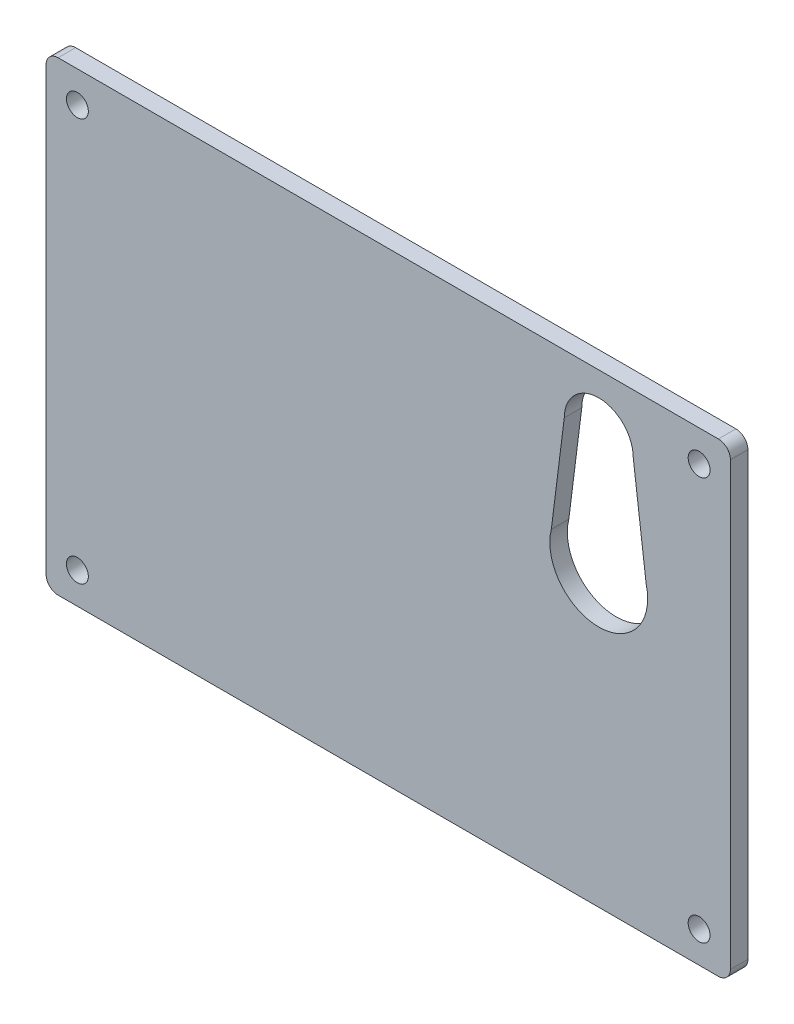
ISO-10303-21;
HEADER;
FILE_DESCRIPTION(('STEP AP214'),'2;1');
FILE_NAME('part.step','',(''),(''),'','','');
FILE_SCHEMA(('AUTOMOTIVE_DESIGN { 1 0 10303 214 1 1 1 1 }'));
ENDSEC;
DATA;
#1=APPLICATION_CONTEXT('core data for automotive mechanical design processes');
#2=APPLICATION_PROTOCOL_DEFINITION('international standard','automotive_design',2000,#1);
#3=PRODUCT_CONTEXT('',#1,'mechanical');
#4=PRODUCT('Part','Part','',(#3));
#5=PRODUCT_RELATED_PRODUCT_CATEGORY('part','',(#4));
#6=PRODUCT_DEFINITION_FORMATION('','',#4);
#7=PRODUCT_DEFINITION_CONTEXT('part definition',#1,'design');
#8=PRODUCT_DEFINITION('design','',#6,#7);
#9=PRODUCT_DEFINITION_SHAPE('','',#8);
#10=(LENGTH_UNIT() NAMED_UNIT(*) SI_UNIT(.MILLI.,.METRE.));
#11=(NAMED_UNIT(*) PLANE_ANGLE_UNIT() SI_UNIT($,.RADIAN.));
#12=(NAMED_UNIT(*) SI_UNIT($,.STERADIAN.) SOLID_ANGLE_UNIT());
#13=UNCERTAINTY_MEASURE_WITH_UNIT(LENGTH_MEASURE(1.E-05),#10,'distance_accuracy_value','');
#14=(GEOMETRIC_REPRESENTATION_CONTEXT(3) GLOBAL_UNCERTAINTY_ASSIGNED_CONTEXT((#13)) GLOBAL_UNIT_ASSIGNED_CONTEXT((#10,
#11,#12)) REPRESENTATION_CONTEXT('',''));
#15=CARTESIAN_POINT('',(0.,0.,0.));
#16=DIRECTION('',(0.,0.,1.));
#17=DIRECTION('',(1.,0.,0.));
#18=AXIS2_PLACEMENT_3D('',#15,#16,#17);
#19=CARTESIAN_POINT('',(33.5751412984427,20.6026828451147,2.));
#20=DIRECTION('',(0.,0.,-1.));
#21=DIRECTION('',(-1.,0.,0.));
#22=AXIS2_PLACEMENT_3D('',#19,#20,#21);
#23=CYLINDRICAL_SURFACE('',#22,3.93700000000001);
#24=CARTESIAN_POINT('',(33.5751412984427,20.6026828451147,0.));
#25=DIRECTION('',(0.,0.,1.));
#26=DIRECTION('',(1.,0.,0.));
#27=AXIS2_PLACEMENT_3D('',#24,#25,#26);
#28=CIRCLE('',#27,3.93700000000001);
#29=CARTESIAN_POINT('',(37.5121412984427,20.6026828451147,0.));
#30=VERTEX_POINT('',#29);
#31=CARTESIAN_POINT('',(29.6381412984427,20.6026828451147,0.));
#32=VERTEX_POINT('',#31);
#33=EDGE_CURVE('E191',#30,#32,#28,.T.);
#34=ORIENTED_EDGE('',*,*,#33,.F.);
#35=DIRECTION('',(0.,0.,-1.));
#36=VECTOR('',#35,1.);
#37=CARTESIAN_POINT('',(37.5121412984427,20.6026828451147,2.));
#38=LINE('',#37,#36);
#39=CARTESIAN_POINT('',(37.5121412984427,20.6026828451147,2.));
#40=VERTEX_POINT('',#39);
#41=EDGE_CURVE('E11',#40,#30,#38,.T.);
#42=ORIENTED_EDGE('',*,*,#41,.F.);
#43=CARTESIAN_POINT('',(33.5751412984427,20.6026828451147,2.));
#44=DIRECTION('',(0.,0.,1.));
#45=DIRECTION('',(1.,0.,0.));
#46=AXIS2_PLACEMENT_3D('',#43,#44,#45);
#47=CIRCLE('',#46,3.93700000000001);
#48=CARTESIAN_POINT('',(29.6381412984427,20.6026828451147,2.));
#49=VERTEX_POINT('',#48);
#50=EDGE_CURVE('E145',#40,#49,#47,.T.);
#51=ORIENTED_EDGE('',*,*,#50,.T.);
#52=DIRECTION('',(0.,0.,-1.));
#53=VECTOR('',#52,1.);
#54=CARTESIAN_POINT('',(29.6381412984427,20.6026828451147,2.));
#55=LINE('',#54,#53);
#56=EDGE_CURVE('E106',#49,#32,#55,.T.);
#57=ORIENTED_EDGE('',*,*,#56,.T.);
#58=EDGE_LOOP('',(#34,#42,#51,#57));
#59=FACE_BOUND('',#58,.T.);
#60=ADVANCED_FACE('F41',(#59),#23,.F.);
#61=CARTESIAN_POINT('',(39.4768304362522,4.95737892728822,2.));
#62=DIRECTION('',(0.992207263968777,0.124598335974414,0.));
#63=DIRECTION('',(-0.124598335974414,0.992207263968777,0.));
#64=AXIS2_PLACEMENT_3D('',#61,#62,#63);
#65=PLANE('',#64);
#66=DIRECTION('',(0.124598335974414,-0.992207263968777,0.));
#67=VECTOR('',#66,1.);
#68=CARTESIAN_POINT('',(39.4768304362522,4.95737892728822,0.));
#69=LINE('',#68,#67);
#70=CARTESIAN_POINT('',(38.9896367446615,8.83702239102872,0.));
#71=VERTEX_POINT('',#70);
#72=EDGE_CURVE('E151',#30,#71,#69,.T.);
#73=ORIENTED_EDGE('',*,*,#72,.T.);
#74=DIRECTION('',(0.,0.,-1.));
#75=VECTOR('',#74,1.);
#76=CARTESIAN_POINT('',(38.9896367446615,8.83702239102872,2.));
#77=LINE('',#76,#75);
#78=CARTESIAN_POINT('',(38.9896367446615,8.83702239102872,2.));
#79=VERTEX_POINT('',#78);
#80=EDGE_CURVE('E51',#79,#71,#77,.T.);
#81=ORIENTED_EDGE('',*,*,#80,.F.);
#82=DIRECTION('',(0.124598335974414,-0.992207263968777,0.));
#83=VECTOR('',#82,1.);
#84=CARTESIAN_POINT('',(39.4768304362522,4.95737892728822,2.));
#85=LINE('',#84,#83);
#86=EDGE_CURVE('E140',#40,#79,#85,.T.);
#87=ORIENTED_EDGE('',*,*,#86,.F.);
#88=ORIENTED_EDGE('',*,*,#41,.T.);
#89=EDGE_LOOP('',(#73,#81,#87,#88));
#90=FACE_BOUND('',#89,.T.);
#91=ADVANCED_FACE('F149',(#90),#65,.F.);
#92=CARTESIAN_POINT('',(33.5751412984427,7.45536285884434,2.));
#93=DIRECTION('',(0.,0.,-1.));
#94=DIRECTION('',(-1.,0.,0.));
#95=AXIS2_PLACEMENT_3D('',#92,#93,#94);
#96=CYLINDRICAL_SURFACE('',#95,5.58800000000001);
#97=CARTESIAN_POINT('',(33.5751412984427,7.45536285884434,0.));
#98=DIRECTION('',(0.,0.,1.));
#99=DIRECTION('',(1.,0.,0.));
#100=AXIS2_PLACEMENT_3D('',#97,#98,#99);
#101=CIRCLE('',#100,5.58800000000001);
#102=CARTESIAN_POINT('',(28.1606458522239,8.83702239102872,0.));
#103=VERTEX_POINT('',#102);
#104=EDGE_CURVE('E195',#103,#71,#101,.T.);
#105=ORIENTED_EDGE('',*,*,#104,.F.);
#106=DIRECTION('',(0.,0.,-1.));
#107=VECTOR('',#106,1.);
#108=CARTESIAN_POINT('',(28.1606458522239,8.83702239102872,2.));
#109=LINE('',#108,#107);
#110=CARTESIAN_POINT('',(28.1606458522239,8.83702239102872,2.));
#111=VERTEX_POINT('',#110);
#112=EDGE_CURVE('E99',#111,#103,#109,.T.);
#113=ORIENTED_EDGE('',*,*,#112,.F.);
#114=CARTESIAN_POINT('',(33.5751412984427,7.45536285884434,2.));
#115=DIRECTION('',(0.,0.,1.));
#116=DIRECTION('',(1.,0.,0.));
#117=AXIS2_PLACEMENT_3D('',#114,#115,#116);
#118=CIRCLE('',#117,5.58800000000001);
#119=EDGE_CURVE('E144',#111,#79,#118,.T.);
#120=ORIENTED_EDGE('',*,*,#119,.T.);
#121=ORIENTED_EDGE('',*,*,#80,.T.);
#122=EDGE_LOOP('',(#105,#113,#120,#121));
#123=FACE_BOUND('',#122,.T.);
#124=ADVANCED_FACE('F156',(#123),#96,.F.);
#125=CARTESIAN_POINT('',(48.6101412984428,0.,2.));
#126=DIRECTION('',(-1.,0.,0.));
#127=DIRECTION('',(0.,0.,1.));
#128=AXIS2_PLACEMENT_3D('',#125,#126,#127);
#129=PLANE('',#128);
#130=DIRECTION('',(0.,1.,0.));
#131=VECTOR('',#130,1.);
#132=CARTESIAN_POINT('',(48.6101412984428,0.,0.));
#133=LINE('',#132,#131);
#134=CARTESIAN_POINT('',(48.6101412984428,-24.4756371411557,0.));
#135=VERTEX_POINT('',#134);
#136=CARTESIAN_POINT('',(48.6101412984428,25.9243628588443,0.));
#137=VERTEX_POINT('',#136);
#138=EDGE_CURVE('E174',#135,#137,#133,.T.);
#139=ORIENTED_EDGE('',*,*,#138,.T.);
#140=DIRECTION('',(0.,0.,-1.));
#141=VECTOR('',#140,1.);
#142=CARTESIAN_POINT('',(48.6101412984428,25.9243628588443,2.));
#143=LINE('',#142,#141);
#144=CARTESIAN_POINT('',(48.6101412984428,25.9243628588443,2.));
#145=VERTEX_POINT('',#144);
#146=EDGE_CURVE('E45',#145,#137,#143,.T.);
#147=ORIENTED_EDGE('',*,*,#146,.F.);
#148=DIRECTION('',(0.,1.,0.));
#149=VECTOR('',#148,1.);
#150=CARTESIAN_POINT('',(48.6101412984428,0.,2.));
#151=LINE('',#150,#149);
#152=CARTESIAN_POINT('',(48.6101412984428,-24.4756371411557,2.));
#153=VERTEX_POINT('',#152);
#154=EDGE_CURVE('E497',#153,#145,#151,.T.);
#155=ORIENTED_EDGE('',*,*,#154,.F.);
#156=DIRECTION('',(0.,0.,-1.));
#157=VECTOR('',#156,1.);
#158=CARTESIAN_POINT('',(48.6101412984428,-24.4756371411557,2.));
#159=LINE('',#158,#157);
#160=EDGE_CURVE('E158',#153,#135,#159,.T.);
#161=ORIENTED_EDGE('',*,*,#160,.T.);
#162=EDGE_LOOP('',(#139,#147,#155,#161));
#163=FACE_BOUND('',#162,.T.);
#164=ADVANCED_FACE('F228',(#163),#129,.F.);
#165=CARTESIAN_POINT('',(47.2351412984428,25.9243628588443,2.));
#166=DIRECTION('',(0.,0.,-1.));
#167=DIRECTION('',(-1.,0.,0.));
#168=AXIS2_PLACEMENT_3D('',#165,#166,#167);
#169=CYLINDRICAL_SURFACE('',#168,1.375);
#170=CARTESIAN_POINT('',(47.2351412984428,25.9243628588443,0.));
#171=DIRECTION('',(0.,0.,1.));
#172=DIRECTION('',(1.,0.,0.));
#173=AXIS2_PLACEMENT_3D('',#170,#171,#172);
#174=CIRCLE('',#173,1.375);
#175=CARTESIAN_POINT('',(47.2351412984428,27.2993628588443,0.));
#176=VERTEX_POINT('',#175);
#177=EDGE_CURVE('E177',#137,#176,#174,.T.);
#178=ORIENTED_EDGE('',*,*,#177,.T.);
#179=DIRECTION('',(0.,0.,-1.));
#180=VECTOR('',#179,1.);
#181=CARTESIAN_POINT('',(47.2351412984428,27.2993628588443,2.));
#182=LINE('',#181,#180);
#183=CARTESIAN_POINT('',(47.2351412984428,27.2993628588443,2.));
#184=VERTEX_POINT('',#183);
#185=EDGE_CURVE('E218',#184,#176,#182,.T.);
#186=ORIENTED_EDGE('',*,*,#185,.F.);
#187=CARTESIAN_POINT('',(47.2351412984428,25.9243628588443,2.));
#188=DIRECTION('',(0.,0.,1.));
#189=DIRECTION('',(1.,0.,0.));
#190=AXIS2_PLACEMENT_3D('',#187,#188,#189);
#191=CIRCLE('',#190,1.375);
#192=EDGE_CURVE('E114',#145,#184,#191,.T.);
#193=ORIENTED_EDGE('',*,*,#192,.F.);
#194=ORIENTED_EDGE('',*,*,#146,.T.);
#195=EDGE_LOOP('',(#178,#186,#193,#194));
#196=FACE_BOUND('',#195,.T.);
#197=ADVANCED_FACE('F224',(#196),#169,.T.);
#198=CARTESIAN_POINT('',(0.,27.2993628588443,2.));
#199=DIRECTION('',(0.,-1.,0.));
#200=DIRECTION('',(0.,0.,-1.));
#201=AXIS2_PLACEMENT_3D('',#198,#199,#200);
#202=PLANE('',#201);
#203=DIRECTION('',(-1.,0.,0.));
#204=VECTOR('',#203,1.);
#205=CARTESIAN_POINT('',(0.,27.2993628588443,0.));
#206=LINE('',#205,#204);
#207=CARTESIAN_POINT('',(-28.1648587015572,27.2993628588443,0.));
#208=VERTEX_POINT('',#207);
#209=EDGE_CURVE('E179',#176,#208,#206,.T.);
#210=ORIENTED_EDGE('',*,*,#209,.T.);
#211=DIRECTION('',(0.,0.,-1.));
#212=VECTOR('',#211,1.);
#213=CARTESIAN_POINT('',(-28.1648587015572,27.2993628588443,2.));
#214=LINE('',#213,#212);
#215=CARTESIAN_POINT('',(-28.1648587015572,27.2993628588443,2.));
#216=VERTEX_POINT('',#215);
#217=EDGE_CURVE('E216',#216,#208,#214,.T.);
#218=ORIENTED_EDGE('',*,*,#217,.F.);
#219=DIRECTION('',(-1.,0.,0.));
#220=VECTOR('',#219,1.);
#221=CARTESIAN_POINT('',(0.,27.2993628588443,2.));
#222=LINE('',#221,#220);
#223=EDGE_CURVE('E247',#184,#216,#222,.T.);
#224=ORIENTED_EDGE('',*,*,#223,.F.);
#225=ORIENTED_EDGE('',*,*,#185,.T.);
#226=EDGE_LOOP('',(#210,#218,#224,#225));
#227=FACE_BOUND('',#226,.T.);
#228=ADVANCED_FACE('F238',(#227),#202,.F.);
#229=CARTESIAN_POINT('',(-28.1648587015572,25.9243628588443,2.));
#230=DIRECTION('',(0.,0.,-1.));
#231=DIRECTION('',(-1.,0.,0.));
#232=AXIS2_PLACEMENT_3D('',#229,#230,#231);
#233=CYLINDRICAL_SURFACE('',#232,1.37499999999999);
#234=CARTESIAN_POINT('',(-28.1648587015572,25.9243628588443,0.));
#235=DIRECTION('',(0.,0.,1.));
#236=DIRECTION('',(1.,0.,0.));
#237=AXIS2_PLACEMENT_3D('',#234,#235,#236);
#238=CIRCLE('',#237,1.37499999999999);
#239=CARTESIAN_POINT('',(-29.5398587015572,25.9243628588443,0.));
#240=VERTEX_POINT('',#239);
#241=EDGE_CURVE('E181',#208,#240,#238,.T.);
#242=ORIENTED_EDGE('',*,*,#241,.T.);
#243=DIRECTION('',(0.,0.,-1.));
#244=VECTOR('',#243,1.);
#245=CARTESIAN_POINT('',(-29.5398587015572,25.9243628588443,2.));
#246=LINE('',#245,#244);
#247=CARTESIAN_POINT('',(-29.5398587015572,25.9243628588443,2.));
#248=VERTEX_POINT('',#247);
#249=EDGE_CURVE('E213',#248,#240,#246,.T.);
#250=ORIENTED_EDGE('',*,*,#249,.F.);
#251=CARTESIAN_POINT('',(-28.1648587015572,25.9243628588443,2.));
#252=DIRECTION('',(0.,0.,1.));
#253=DIRECTION('',(1.,0.,0.));
#254=AXIS2_PLACEMENT_3D('',#251,#252,#253);
#255=CIRCLE('',#254,1.37499999999999);
#256=EDGE_CURVE('E243',#216,#248,#255,.T.);
#257=ORIENTED_EDGE('',*,*,#256,.F.);
#258=ORIENTED_EDGE('',*,*,#217,.T.);
#259=EDGE_LOOP('',(#242,#250,#257,#258));
#260=FACE_BOUND('',#259,.T.);
#261=ADVANCED_FACE('F241',(#260),#233,.T.);
#262=CARTESIAN_POINT('',(-29.5398587015572,0.,2.));
#263=DIRECTION('',(1.,0.,0.));
#264=DIRECTION('',(0.,0.,-1.));
#265=AXIS2_PLACEMENT_3D('',#262,#263,#264);
#266=PLANE('',#265);
#267=DIRECTION('',(0.,-1.,0.));
#268=VECTOR('',#267,1.);
#269=CARTESIAN_POINT('',(-29.5398587015572,0.,0.));
#270=LINE('',#269,#268);
#271=CARTESIAN_POINT('',(-29.5398587015572,-24.4756371411557,0.));
#272=VERTEX_POINT('',#271);
#273=EDGE_CURVE('E183',#240,#272,#270,.T.);
#274=ORIENTED_EDGE('',*,*,#273,.T.);
#275=DIRECTION('',(0.,0.,-1.));
#276=VECTOR('',#275,1.);
#277=CARTESIAN_POINT('',(-29.5398587015572,-24.4756371411557,2.));
#278=LINE('',#277,#276);
#279=CARTESIAN_POINT('',(-29.5398587015572,-24.4756371411557,2.));
#280=VERTEX_POINT('',#279);
#281=EDGE_CURVE('E210',#280,#272,#278,.T.);
#282=ORIENTED_EDGE('',*,*,#281,.F.);
#283=DIRECTION('',(0.,-1.,0.));
#284=VECTOR('',#283,1.);
#285=CARTESIAN_POINT('',(-29.5398587015572,0.,2.));
#286=LINE('',#285,#284);
#287=EDGE_CURVE('E246',#248,#280,#286,.T.);
#288=ORIENTED_EDGE('',*,*,#287,.F.);
#289=ORIENTED_EDGE('',*,*,#249,.T.);
#290=EDGE_LOOP('',(#274,#282,#288,#289));
#291=FACE_BOUND('',#290,.T.);
#292=ADVANCED_FACE('F290',(#291),#266,.F.);
#293=CARTESIAN_POINT('',(-28.1648587015572,-24.4756371411557,2.));
#294=DIRECTION('',(0.,0.,-1.));
#295=DIRECTION('',(-1.,0.,0.));
#296=AXIS2_PLACEMENT_3D('',#293,#294,#295);
#297=CYLINDRICAL_SURFACE('',#296,1.375);
#298=CARTESIAN_POINT('',(-28.1648587015572,-24.4756371411557,0.));
#299=DIRECTION('',(0.,0.,1.));
#300=DIRECTION('',(1.,0.,0.));
#301=AXIS2_PLACEMENT_3D('',#298,#299,#300);
#302=CIRCLE('',#301,1.375);
#303=CARTESIAN_POINT('',(-28.1648587015572,-25.8506371411557,0.));
#304=VERTEX_POINT('',#303);
#305=EDGE_CURVE('E185',#272,#304,#302,.T.);
#306=ORIENTED_EDGE('',*,*,#305,.T.);
#307=DIRECTION('',(0.,0.,-1.));
#308=VECTOR('',#307,1.);
#309=CARTESIAN_POINT('',(-28.1648587015572,-25.8506371411557,2.));
#310=LINE('',#309,#308);
#311=CARTESIAN_POINT('',(-28.1648587015572,-25.8506371411557,2.));
#312=VERTEX_POINT('',#311);
#313=EDGE_CURVE('E207',#312,#304,#310,.T.);
#314=ORIENTED_EDGE('',*,*,#313,.F.);
#315=CARTESIAN_POINT('',(-28.1648587015572,-24.4756371411557,2.));
#316=DIRECTION('',(0.,0.,1.));
#317=DIRECTION('',(1.,0.,0.));
#318=AXIS2_PLACEMENT_3D('',#315,#316,#317);
#319=CIRCLE('',#318,1.375);
#320=EDGE_CURVE('E249',#280,#312,#319,.T.);
#321=ORIENTED_EDGE('',*,*,#320,.F.);
#322=ORIENTED_EDGE('',*,*,#281,.T.);
#323=EDGE_LOOP('',(#306,#314,#321,#322));
#324=FACE_BOUND('',#323,.T.);
#325=ADVANCED_FACE('F286',(#324),#297,.T.);
#326=CARTESIAN_POINT('',(0.,-25.8506371411557,2.));
#327=DIRECTION('',(0.,1.,0.));
#328=DIRECTION('',(0.,0.,1.));
#329=AXIS2_PLACEMENT_3D('',#326,#327,#328);
#330=PLANE('',#329);
#331=DIRECTION('',(1.,0.,0.));
#332=VECTOR('',#331,1.);
#333=CARTESIAN_POINT('',(0.,-25.8506371411557,0.));
#334=LINE('',#333,#332);
#335=CARTESIAN_POINT('',(47.2351412984428,-25.8506371411557,0.));
#336=VERTEX_POINT('',#335);
#337=EDGE_CURVE('E187',#304,#336,#334,.T.);
#338=ORIENTED_EDGE('',*,*,#337,.T.);
#339=DIRECTION('',(0.,0.,-1.));
#340=VECTOR('',#339,1.);
#341=CARTESIAN_POINT('',(47.2351412984428,-25.8506371411557,2.));
#342=LINE('',#341,#340);
#343=CARTESIAN_POINT('',(47.2351412984428,-25.8506371411557,2.));
#344=VERTEX_POINT('',#343);
#345=EDGE_CURVE('E204',#344,#336,#342,.T.);
#346=ORIENTED_EDGE('',*,*,#345,.F.);
#347=DIRECTION('',(1.,0.,0.));
#348=VECTOR('',#347,1.);
#349=CARTESIAN_POINT('',(0.,-25.8506371411557,2.));
#350=LINE('',#349,#348);
#351=EDGE_CURVE('E255',#312,#344,#350,.T.);
#352=ORIENTED_EDGE('',*,*,#351,.F.);
#353=ORIENTED_EDGE('',*,*,#313,.T.);
#354=EDGE_LOOP('',(#338,#346,#352,#353));
#355=FACE_BOUND('',#354,.T.);
#356=ADVANCED_FACE('F282',(#355),#330,.F.);
#357=CARTESIAN_POINT('',(47.2351412984428,-24.4756371411557,2.));
#358=DIRECTION('',(0.,0.,-1.));
#359=DIRECTION('',(-1.,0.,0.));
#360=AXIS2_PLACEMENT_3D('',#357,#358,#359);
#361=CYLINDRICAL_SURFACE('',#360,1.375);
#362=CARTESIAN_POINT('',(47.2351412984428,-24.4756371411557,0.));
#363=DIRECTION('',(0.,0.,1.));
#364=DIRECTION('',(1.,0.,0.));
#365=AXIS2_PLACEMENT_3D('',#362,#363,#364);
#366=CIRCLE('',#365,1.375);
#367=EDGE_CURVE('E189',#336,#135,#366,.T.);
#368=ORIENTED_EDGE('',*,*,#367,.T.);
#369=ORIENTED_EDGE('',*,*,#160,.F.);
#370=CARTESIAN_POINT('',(47.2351412984428,-24.4756371411557,2.));
#371=DIRECTION('',(0.,0.,1.));
#372=DIRECTION('',(1.,0.,0.));
#373=AXIS2_PLACEMENT_3D('',#370,#371,#372);
#374=CIRCLE('',#373,1.375);
#375=EDGE_CURVE('E257',#344,#153,#374,.T.);
#376=ORIENTED_EDGE('',*,*,#375,.F.);
#377=ORIENTED_EDGE('',*,*,#345,.T.);
#378=EDGE_LOOP('',(#368,#369,#376,#377));
#379=FACE_BOUND('',#378,.T.);
#380=ADVANCED_FACE('F278',(#379),#361,.T.);
#381=CARTESIAN_POINT('',(45.0351412984428,-22.2756371411557,2.));
#382=DIRECTION('',(0.,0.,-1.));
#383=DIRECTION('',(-1.,0.,0.));
#384=AXIS2_PLACEMENT_3D('',#381,#382,#383);
#385=CYLINDRICAL_SURFACE('',#384,1.25);
#386=CARTESIAN_POINT('',(45.0351412984428,-22.2756371411557,2.));
#387=DIRECTION('',(0.,0.,1.));
#388=DIRECTION('',(1.,0.,0.));
#389=AXIS2_PLACEMENT_3D('',#386,#387,#388);
#390=CIRCLE('',#389,1.25);
#391=CARTESIAN_POINT('',(46.2851412984428,-22.2756371411557,2.));
#392=VERTEX_POINT('',#391);
#393=EDGE_CURVE('E490',#392,#392,#390,.F.);
#394=ORIENTED_EDGE('',*,*,#393,.F.);
#395=EDGE_LOOP('',(#394));
#396=FACE_BOUND('',#395,.T.);
#397=CARTESIAN_POINT('',(45.0351412984428,-22.2756371411557,0.));
#398=DIRECTION('',(0.,0.,1.));
#399=DIRECTION('',(1.,0.,0.));
#400=AXIS2_PLACEMENT_3D('',#397,#398,#399);
#401=CIRCLE('',#400,1.25);
#402=CARTESIAN_POINT('',(46.2851412984428,-22.2756371411557,0.));
#403=VERTEX_POINT('',#402);
#404=EDGE_CURVE('E171',#403,#403,#401,.F.);
#405=ORIENTED_EDGE('',*,*,#404,.T.);
#406=EDGE_LOOP('',(#405));
#407=FACE_BOUND('',#406,.T.);
#408=ADVANCED_FACE('F281',(#396,#407),#385,.F.);
#409=CARTESIAN_POINT('',(-25.9648587015572,23.7243628588443,2.));
#410=DIRECTION('',(0.,0.,-1.));
#411=DIRECTION('',(-1.,0.,0.));
#412=AXIS2_PLACEMENT_3D('',#409,#410,#411);
#413=CYLINDRICAL_SURFACE('',#412,1.25);
#414=CARTESIAN_POINT('',(-25.9648587015572,23.7243628588443,2.));
#415=DIRECTION('',(0.,0.,1.));
#416=DIRECTION('',(1.,0.,0.));
#417=AXIS2_PLACEMENT_3D('',#414,#415,#416);
#418=CIRCLE('',#417,1.25);
#419=CARTESIAN_POINT('',(-24.7148587015572,23.7243628588443,2.));
#420=VERTEX_POINT('',#419);
#421=EDGE_CURVE('E487',#420,#420,#418,.F.);
#422=ORIENTED_EDGE('',*,*,#421,.F.);
#423=EDGE_LOOP('',(#422));
#424=FACE_BOUND('',#423,.T.);
#425=CARTESIAN_POINT('',(-25.9648587015572,23.7243628588443,0.));
#426=DIRECTION('',(0.,0.,1.));
#427=DIRECTION('',(1.,0.,0.));
#428=AXIS2_PLACEMENT_3D('',#425,#426,#427);
#429=CIRCLE('',#428,1.25);
#430=CARTESIAN_POINT('',(-24.7148587015572,23.7243628588443,0.));
#431=VERTEX_POINT('',#430);
#432=EDGE_CURVE('E168',#431,#431,#429,.F.);
#433=ORIENTED_EDGE('',*,*,#432,.T.);
#434=EDGE_LOOP('',(#433));
#435=FACE_BOUND('',#434,.T.);
#436=ADVANCED_FACE('F305',(#424,#435),#413,.F.);
#437=CARTESIAN_POINT('',(-25.9648587015572,-22.2756371411557,2.));
#438=DIRECTION('',(0.,0.,-1.));
#439=DIRECTION('',(-1.,0.,0.));
#440=AXIS2_PLACEMENT_3D('',#437,#438,#439);
#441=CYLINDRICAL_SURFACE('',#440,1.25);
#442=CARTESIAN_POINT('',(-25.9648587015572,-22.2756371411557,2.));
#443=DIRECTION('',(0.,0.,1.));
#444=DIRECTION('',(1.,0.,0.));
#445=AXIS2_PLACEMENT_3D('',#442,#443,#444);
#446=CIRCLE('',#445,1.25);
#447=CARTESIAN_POINT('',(-24.7148587015572,-22.2756371411557,2.));
#448=VERTEX_POINT('',#447);
#449=EDGE_CURVE('E316',#448,#448,#446,.F.);
#450=ORIENTED_EDGE('',*,*,#449,.F.);
#451=EDGE_LOOP('',(#450));
#452=FACE_BOUND('',#451,.T.);
#453=CARTESIAN_POINT('',(-25.9648587015572,-22.2756371411557,0.));
#454=DIRECTION('',(0.,0.,1.));
#455=DIRECTION('',(1.,0.,0.));
#456=AXIS2_PLACEMENT_3D('',#453,#454,#455);
#457=CIRCLE('',#456,1.25);
#458=CARTESIAN_POINT('',(-24.7148587015572,-22.2756371411557,0.));
#459=VERTEX_POINT('',#458);
#460=EDGE_CURVE('E165',#459,#459,#457,.F.);
#461=ORIENTED_EDGE('',*,*,#460,.T.);
#462=EDGE_LOOP('',(#461));
#463=FACE_BOUND('',#462,.T.);
#464=ADVANCED_FACE('F267',(#452,#463),#441,.F.);
#465=CARTESIAN_POINT('',(45.0351412984428,23.7243628588443,2.));
#466=DIRECTION('',(0.,0.,-1.));
#467=DIRECTION('',(-1.,0.,0.));
#468=AXIS2_PLACEMENT_3D('',#465,#466,#467);
#469=CYLINDRICAL_SURFACE('',#468,1.25);
#470=CARTESIAN_POINT('',(45.0351412984428,23.7243628588443,2.));
#471=DIRECTION('',(0.,0.,1.));
#472=DIRECTION('',(1.,0.,0.));
#473=AXIS2_PLACEMENT_3D('',#470,#471,#472);
#474=CIRCLE('',#473,1.25);
#475=CARTESIAN_POINT('',(46.2851412984428,23.7243628588443,2.));
#476=VERTEX_POINT('',#475);
#477=EDGE_CURVE('E199',#476,#476,#474,.F.);
#478=ORIENTED_EDGE('',*,*,#477,.F.);
#479=EDGE_LOOP('',(#478));
#480=FACE_BOUND('',#479,.T.);
#481=CARTESIAN_POINT('',(45.0351412984428,23.7243628588443,0.));
#482=DIRECTION('',(0.,0.,1.));
#483=DIRECTION('',(1.,0.,0.));
#484=AXIS2_PLACEMENT_3D('',#481,#482,#483);
#485=CIRCLE('',#484,1.25);
#486=CARTESIAN_POINT('',(46.2851412984428,23.7243628588443,0.));
#487=VERTEX_POINT('',#486);
#488=EDGE_CURVE('E162',#487,#487,#485,.F.);
#489=ORIENTED_EDGE('',*,*,#488,.T.);
#490=EDGE_LOOP('',(#489));
#491=FACE_BOUND('',#490,.T.);
#492=ADVANCED_FACE('F43',(#480,#491),#469,.F.);
#493=CARTESIAN_POINT('',(26.6309611246406,-3.34423417568724,2.));
#494=DIRECTION('',(-0.992207263968778,0.124598335974413,0.));
#495=DIRECTION('',(-0.124598335974413,-0.992207263968778,0.));
#496=AXIS2_PLACEMENT_3D('',#493,#494,#495);
#497=PLANE('',#496);
#498=DIRECTION('',(0.124598335974413,0.992207263968777,0.));
#499=VECTOR('',#498,1.);
#500=CARTESIAN_POINT('',(26.6309611246406,-3.34423417568724,0.));
#501=LINE('',#500,#499);
#502=EDGE_CURVE('E197',#103,#32,#501,.T.);
#503=ORIENTED_EDGE('',*,*,#502,.T.);
#504=ORIENTED_EDGE('',*,*,#56,.F.);
#505=DIRECTION('',(0.124598335974413,0.992207263968777,0.));
#506=VECTOR('',#505,1.);
#507=CARTESIAN_POINT('',(26.6309611246406,-3.34423417568724,2.));
#508=LINE('',#507,#506);
#509=EDGE_CURVE('E60',#111,#49,#508,.T.);
#510=ORIENTED_EDGE('',*,*,#509,.F.);
#511=ORIENTED_EDGE('',*,*,#112,.T.);
#512=EDGE_LOOP('',(#503,#504,#510,#511));
#513=FACE_BOUND('',#512,.T.);
#514=ADVANCED_FACE('F258',(#513),#497,.F.);
#515=CARTESIAN_POINT('',(0.,0.,2.));
#516=DIRECTION('',(0.,0.,1.));
#517=DIRECTION('',(1.,0.,0.));
#518=AXIS2_PLACEMENT_3D('',#515,#516,#517);
#519=PLANE('',#518);
#520=ORIENTED_EDGE('',*,*,#477,.T.);
#521=EDGE_LOOP('',(#520));
#522=FACE_BOUND('',#521,.T.);
#523=ORIENTED_EDGE('',*,*,#449,.T.);
#524=EDGE_LOOP('',(#523));
#525=FACE_BOUND('',#524,.T.);
#526=ORIENTED_EDGE('',*,*,#421,.T.);
#527=EDGE_LOOP('',(#526));
#528=FACE_BOUND('',#527,.T.);
#529=ORIENTED_EDGE('',*,*,#393,.T.);
#530=EDGE_LOOP('',(#529));
#531=FACE_BOUND('',#530,.T.);
#532=ORIENTED_EDGE('',*,*,#154,.T.);
#533=ORIENTED_EDGE('',*,*,#192,.T.);
#534=ORIENTED_EDGE('',*,*,#223,.T.);
#535=ORIENTED_EDGE('',*,*,#256,.T.);
#536=ORIENTED_EDGE('',*,*,#287,.T.);
#537=ORIENTED_EDGE('',*,*,#320,.T.);
#538=ORIENTED_EDGE('',*,*,#351,.T.);
#539=ORIENTED_EDGE('',*,*,#375,.T.);
#540=EDGE_LOOP('',(#532,#533,#534,#535,#536,#537,#538,#539));
#541=FACE_BOUND('',#540,.T.);
#542=ORIENTED_EDGE('',*,*,#50,.F.);
#543=ORIENTED_EDGE('',*,*,#86,.T.);
#544=ORIENTED_EDGE('',*,*,#119,.F.);
#545=ORIENTED_EDGE('',*,*,#509,.T.);
#546=EDGE_LOOP('',(#542,#543,#544,#545));
#547=FACE_BOUND('',#546,.T.);
#548=ADVANCED_FACE('F142',(#522,#525,#528,#531,#541,#547),#519,.T.);
#549=CARTESIAN_POINT('',(0.,0.,0.));
#550=DIRECTION('',(0.,0.,1.));
#551=DIRECTION('',(1.,0.,0.));
#552=AXIS2_PLACEMENT_3D('',#549,#550,#551);
#553=PLANE('',#552);
#554=ORIENTED_EDGE('',*,*,#488,.F.);
#555=EDGE_LOOP('',(#554));
#556=FACE_BOUND('',#555,.T.);
#557=ORIENTED_EDGE('',*,*,#460,.F.);
#558=EDGE_LOOP('',(#557));
#559=FACE_BOUND('',#558,.T.);
#560=ORIENTED_EDGE('',*,*,#432,.F.);
#561=EDGE_LOOP('',(#560));
#562=FACE_BOUND('',#561,.T.);
#563=ORIENTED_EDGE('',*,*,#404,.F.);
#564=EDGE_LOOP('',(#563));
#565=FACE_BOUND('',#564,.T.);
#566=ORIENTED_EDGE('',*,*,#138,.F.);
#567=ORIENTED_EDGE('',*,*,#367,.F.);
#568=ORIENTED_EDGE('',*,*,#337,.F.);
#569=ORIENTED_EDGE('',*,*,#305,.F.);
#570=ORIENTED_EDGE('',*,*,#273,.F.);
#571=ORIENTED_EDGE('',*,*,#241,.F.);
#572=ORIENTED_EDGE('',*,*,#209,.F.);
#573=ORIENTED_EDGE('',*,*,#177,.F.);
#574=EDGE_LOOP('',(#566,#567,#568,#569,#570,#571,#572,#573));
#575=FACE_BOUND('',#574,.T.);
#576=ORIENTED_EDGE('',*,*,#33,.T.);
#577=ORIENTED_EDGE('',*,*,#502,.F.);
#578=ORIENTED_EDGE('',*,*,#104,.T.);
#579=ORIENTED_EDGE('',*,*,#72,.F.);
#580=EDGE_LOOP('',(#576,#577,#578,#579));
#581=FACE_BOUND('',#580,.T.);
#582=ADVANCED_FACE('F232',(#556,#559,#562,#565,#575,#581),#553,.F.);
#583=CLOSED_SHELL('',(#60,#91,#124,#164,#197,#228,#261,#292,#325,#356,#380,#408,#436,#464,#492,
#514,#548,#582));
#584=MANIFOLD_SOLID_BREP('B2',#583);
#585=ADVANCED_BREP_SHAPE_REPRESENTATION('',(#18,#584),#14);
#586=SHAPE_DEFINITION_REPRESENTATION(#9,#585);
ENDSEC;
END-ISO-10303-21;
